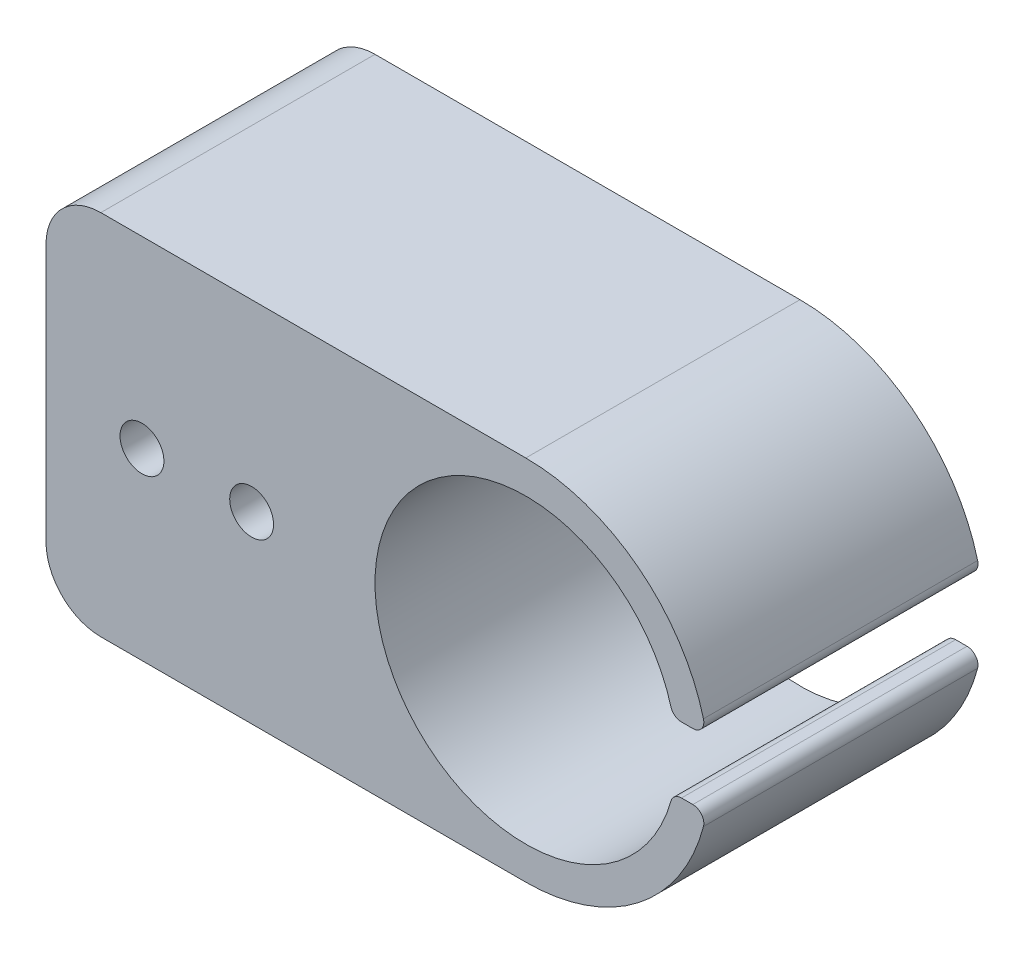
ISO-10303-21;
HEADER;
FILE_DESCRIPTION(('STEP AP214'),'2;1');
FILE_NAME('part.step','',(''),(''),'','','');
FILE_SCHEMA(('AUTOMOTIVE_DESIGN { 1 0 10303 214 1 1 1 1 }'));
ENDSEC;
DATA;
#1=APPLICATION_CONTEXT('core data for automotive mechanical design processes');
#2=APPLICATION_PROTOCOL_DEFINITION('international standard','automotive_design',2000,#1);
#3=PRODUCT_CONTEXT('',#1,'mechanical');
#4=PRODUCT('Part','Part','',(#3));
#5=PRODUCT_RELATED_PRODUCT_CATEGORY('part','',(#4));
#6=PRODUCT_DEFINITION_FORMATION('','',#4);
#7=PRODUCT_DEFINITION_CONTEXT('part definition',#1,'design');
#8=PRODUCT_DEFINITION('design','',#6,#7);
#9=PRODUCT_DEFINITION_SHAPE('','',#8);
#10=(LENGTH_UNIT() NAMED_UNIT(*) SI_UNIT(.MILLI.,.METRE.));
#11=(NAMED_UNIT(*) PLANE_ANGLE_UNIT() SI_UNIT($,.RADIAN.));
#12=(NAMED_UNIT(*) SI_UNIT($,.STERADIAN.) SOLID_ANGLE_UNIT());
#13=UNCERTAINTY_MEASURE_WITH_UNIT(LENGTH_MEASURE(1.E-05),#10,'distance_accuracy_value','');
#14=(GEOMETRIC_REPRESENTATION_CONTEXT(3) GLOBAL_UNCERTAINTY_ASSIGNED_CONTEXT((#13)) GLOBAL_UNIT_ASSIGNED_CONTEXT((#10,
#11,#12)) REPRESENTATION_CONTEXT('',''));
#15=CARTESIAN_POINT('',(0.,0.,0.));
#16=DIRECTION('',(0.,0.,1.));
#17=DIRECTION('',(1.,0.,0.));
#18=AXIS2_PLACEMENT_3D('',#15,#16,#17);
#19=CARTESIAN_POINT('',(-35.,0.,25.));
#20=DIRECTION('',(0.,0.,-1.));
#21=DIRECTION('',(-1.,0.,0.));
#22=AXIS2_PLACEMENT_3D('',#19,#20,#21);
#23=CYLINDRICAL_SURFACE('',#22,2.);
#24=CARTESIAN_POINT('',(-35.,0.,25.));
#25=DIRECTION('',(0.,0.,1.));
#26=DIRECTION('',(1.,0.,0.));
#27=AXIS2_PLACEMENT_3D('',#24,#25,#26);
#28=CIRCLE('',#27,2.);
#29=CARTESIAN_POINT('',(-33.,0.,25.));
#30=VERTEX_POINT('',#29);
#31=EDGE_CURVE('E200',#30,#30,#28,.T.);
#32=ORIENTED_EDGE('',*,*,#31,.T.);
#33=EDGE_LOOP('',(#32));
#34=FACE_BOUND('',#33,.T.);
#35=CARTESIAN_POINT('',(-35.,0.,10.));
#36=DIRECTION('',(0.,0.,-1.));
#37=DIRECTION('',(-1.,0.,0.));
#38=AXIS2_PLACEMENT_3D('',#35,#36,#37);
#39=CIRCLE('',#38,2.);
#40=CARTESIAN_POINT('',(-37.,0.,10.));
#41=VERTEX_POINT('',#40);
#42=EDGE_CURVE('E194',#41,#41,#39,.T.);
#43=ORIENTED_EDGE('',*,*,#42,.T.);
#44=EDGE_LOOP('',(#43));
#45=FACE_BOUND('',#44,.T.);
#46=ADVANCED_FACE('F38',(#34,#45),#23,.F.);
#47=CARTESIAN_POINT('',(-25.,0.,25.));
#48=DIRECTION('',(0.,0.,-1.));
#49=DIRECTION('',(-1.,0.,0.));
#50=AXIS2_PLACEMENT_3D('',#47,#48,#49);
#51=CYLINDRICAL_SURFACE('',#50,2.);
#52=CARTESIAN_POINT('',(-25.,0.,25.));
#53=DIRECTION('',(0.,0.,1.));
#54=DIRECTION('',(1.,0.,0.));
#55=AXIS2_PLACEMENT_3D('',#52,#53,#54);
#56=CIRCLE('',#55,2.);
#57=CARTESIAN_POINT('',(-23.,0.,25.));
#58=VERTEX_POINT('',#57);
#59=EDGE_CURVE('E197',#58,#58,#56,.T.);
#60=ORIENTED_EDGE('',*,*,#59,.T.);
#61=EDGE_LOOP('',(#60));
#62=FACE_BOUND('',#61,.T.);
#63=CARTESIAN_POINT('',(-25.,0.,10.));
#64=DIRECTION('',(0.,0.,-1.));
#65=DIRECTION('',(-1.,0.,0.));
#66=AXIS2_PLACEMENT_3D('',#63,#64,#65);
#67=CIRCLE('',#66,2.);
#68=CARTESIAN_POINT('',(-27.,0.,10.));
#69=VERTEX_POINT('',#68);
#70=EDGE_CURVE('E42',#69,#69,#67,.T.);
#71=ORIENTED_EDGE('',*,*,#70,.T.);
#72=EDGE_LOOP('',(#71));
#73=FACE_BOUND('',#72,.T.);
#74=ADVANCED_FACE('F383',(#62,#73),#51,.F.);
#75=CARTESIAN_POINT('',(0.,0.,25.));
#76=DIRECTION('',(0.,0.,1.));
#77=DIRECTION('',(1.,0.,0.));
#78=AXIS2_PLACEMENT_3D('',#75,#76,#77);
#79=PLANE('',#78);
#80=ORIENTED_EDGE('',*,*,#31,.F.);
#81=EDGE_LOOP('',(#80));
#82=FACE_BOUND('',#81,.T.);
#83=CARTESIAN_POINT('',(0.,0.,25.));
#84=DIRECTION('',(0.,0.,1.));
#85=DIRECTION('',(-1.,0.,0.));
#86=AXIS2_PLACEMENT_3D('',#83,#84,#85);
#87=CIRCLE('',#86,16.75);
#88=CARTESIAN_POINT('',(0.,-16.75,25.));
#89=VERTEX_POINT('',#88);
#90=CARTESIAN_POINT('',(16.2008102912858,-4.25396825396825,25.));
#91=VERTEX_POINT('',#90);
#92=EDGE_CURVE('E220',#89,#91,#87,.T.);
#93=ORIENTED_EDGE('',*,*,#92,.T.);
#94=CARTESIAN_POINT('',(15.2335977365821,-4.,25.));
#95=DIRECTION('',(0.,0.,1.));
#96=DIRECTION('',(1.,0.,0.));
#97=AXIS2_PLACEMENT_3D('',#94,#95,#96);
#98=CIRCLE('',#97,1.);
#99=CARTESIAN_POINT('',(15.2335977365821,-3.,25.));
#100=VERTEX_POINT('',#99);
#101=EDGE_CURVE('E289',#91,#100,#98,.T.);
#102=ORIENTED_EDGE('',*,*,#101,.T.);
#103=DIRECTION('',(-1.,0.,0.));
#104=VECTOR('',#103,1.);
#105=CARTESIAN_POINT('',(16.479153497677,-3.,25.));
#106=LINE('',#105,#104);
#107=CARTESIAN_POINT('',(14.1972708645007,-3.,25.));
#108=VERTEX_POINT('',#107);
#109=EDGE_CURVE('E223',#100,#108,#106,.T.);
#110=ORIENTED_EDGE('',*,*,#109,.T.);
#111=CARTESIAN_POINT('',(14.1972708645007,-4.,25.));
#112=DIRECTION('',(0.,0.,1.));
#113=DIRECTION('',(1.,0.,0.));
#114=AXIS2_PLACEMENT_3D('',#111,#112,#113);
#115=CIRCLE('',#114,1.);
#116=CARTESIAN_POINT('',(13.2347440262295,-3.72881355932203,25.));
#117=VERTEX_POINT('',#116);
#118=EDGE_CURVE('E286',#108,#117,#115,.T.);
#119=ORIENTED_EDGE('',*,*,#118,.T.);
#120=CARTESIAN_POINT('',(0.,0.,25.));
#121=DIRECTION('',(0.,0.,-1.));
#122=DIRECTION('',(1.,0.,0.));
#123=AXIS2_PLACEMENT_3D('',#120,#121,#122);
#124=CIRCLE('',#123,13.75);
#125=CARTESIAN_POINT('',(13.2347440262295,3.72881355932203,25.));
#126=VERTEX_POINT('',#125);
#127=EDGE_CURVE('E204',#117,#126,#124,.T.);
#128=ORIENTED_EDGE('',*,*,#127,.T.);
#129=CARTESIAN_POINT('',(14.1972708645007,4.,25.));
#130=DIRECTION('',(0.,0.,1.));
#131=DIRECTION('',(1.,0.,0.));
#132=AXIS2_PLACEMENT_3D('',#129,#130,#131);
#133=CIRCLE('',#132,1.);
#134=CARTESIAN_POINT('',(14.1972708645007,3.,25.));
#135=VERTEX_POINT('',#134);
#136=EDGE_CURVE('E284',#126,#135,#133,.T.);
#137=ORIENTED_EDGE('',*,*,#136,.T.);
#138=DIRECTION('',(1.,0.,0.));
#139=VECTOR('',#138,1.);
#140=CARTESIAN_POINT('',(13.4187369003196,3.,25.));
#141=LINE('',#140,#139);
#142=CARTESIAN_POINT('',(15.2335977365821,3.,25.));
#143=VERTEX_POINT('',#142);
#144=EDGE_CURVE('E207',#135,#143,#141,.T.);
#145=ORIENTED_EDGE('',*,*,#144,.T.);
#146=CARTESIAN_POINT('',(15.2335977365821,4.,25.));
#147=DIRECTION('',(0.,0.,1.));
#148=DIRECTION('',(1.,0.,0.));
#149=AXIS2_PLACEMENT_3D('',#146,#147,#148);
#150=CIRCLE('',#149,1.);
#151=CARTESIAN_POINT('',(16.2008102912858,4.25396825396825,25.));
#152=VERTEX_POINT('',#151);
#153=EDGE_CURVE('E62',#143,#152,#150,.T.);
#154=ORIENTED_EDGE('',*,*,#153,.T.);
#155=CARTESIAN_POINT('',(0.,0.,25.));
#156=DIRECTION('',(0.,0.,1.));
#157=DIRECTION('',(1.,0.,0.));
#158=AXIS2_PLACEMENT_3D('',#155,#156,#157);
#159=CIRCLE('',#158,16.75);
#160=CARTESIAN_POINT('',(0.,16.75,25.));
#161=VERTEX_POINT('',#160);
#162=EDGE_CURVE('E210',#152,#161,#159,.T.);
#163=ORIENTED_EDGE('',*,*,#162,.T.);
#164=DIRECTION('',(-1.,0.,0.));
#165=VECTOR('',#164,1.);
#166=CARTESIAN_POINT('',(-43.75,16.75,25.));
#167=LINE('',#166,#165);
#168=CARTESIAN_POINT('',(-38.75,16.75,25.));
#169=VERTEX_POINT('',#168);
#170=EDGE_CURVE('E212',#161,#169,#167,.T.);
#171=ORIENTED_EDGE('',*,*,#170,.T.);
#172=CARTESIAN_POINT('',(-38.75,11.75,25.));
#173=DIRECTION('',(0.,0.,1.));
#174=DIRECTION('',(1.,0.,0.));
#175=AXIS2_PLACEMENT_3D('',#172,#173,#174);
#176=CIRCLE('',#175,5.);
#177=CARTESIAN_POINT('',(-43.75,11.75,25.));
#178=VERTEX_POINT('',#177);
#179=EDGE_CURVE('E263',#169,#178,#176,.T.);
#180=ORIENTED_EDGE('',*,*,#179,.T.);
#181=DIRECTION('',(0.,-1.,0.));
#182=VECTOR('',#181,1.);
#183=CARTESIAN_POINT('',(-43.75,-16.75,25.));
#184=LINE('',#183,#182);
#185=CARTESIAN_POINT('',(-43.75,-11.75,25.));
#186=VERTEX_POINT('',#185);
#187=EDGE_CURVE('E215',#178,#186,#184,.T.);
#188=ORIENTED_EDGE('',*,*,#187,.T.);
#189=CARTESIAN_POINT('',(-38.75,-11.75,25.));
#190=DIRECTION('',(0.,0.,1.));
#191=DIRECTION('',(1.,0.,0.));
#192=AXIS2_PLACEMENT_3D('',#189,#190,#191);
#193=CIRCLE('',#192,5.);
#194=CARTESIAN_POINT('',(-38.75,-16.75,25.));
#195=VERTEX_POINT('',#194);
#196=EDGE_CURVE('E265',#186,#195,#193,.T.);
#197=ORIENTED_EDGE('',*,*,#196,.T.);
#198=DIRECTION('',(1.,0.,0.));
#199=VECTOR('',#198,1.);
#200=CARTESIAN_POINT('',(0.,-16.75,25.));
#201=LINE('',#200,#199);
#202=EDGE_CURVE('E218',#195,#89,#201,.T.);
#203=ORIENTED_EDGE('',*,*,#202,.T.);
#204=EDGE_LOOP('',(#93,#102,#110,#119,#128,#137,#145,#154,#163,#171,#180,#188,#197,#203));
#205=FACE_BOUND('',#204,.T.);
#206=ORIENTED_EDGE('',*,*,#59,.F.);
#207=EDGE_LOOP('',(#206));
#208=FACE_BOUND('',#207,.T.);
#209=ADVANCED_FACE('F307',(#82,#205,#208),#79,.T.);
#210=CARTESIAN_POINT('',(0.,0.,0.));
#211=DIRECTION('',(0.,0.,1.));
#212=DIRECTION('',(1.,0.,0.));
#213=AXIS2_PLACEMENT_3D('',#210,#211,#212);
#214=PLANE('',#213);
#215=DIRECTION('',(0.,-1.,0.));
#216=VECTOR('',#215,1.);
#217=CARTESIAN_POINT('',(-43.75,-16.75,0.));
#218=LINE('',#217,#216);
#219=CARTESIAN_POINT('',(-43.75,-10.1,0.));
#220=VERTEX_POINT('',#219);
#221=CARTESIAN_POINT('',(-43.75,-11.75,0.));
#222=VERTEX_POINT('',#221);
#223=EDGE_CURVE('E237',#220,#222,#218,.T.);
#224=ORIENTED_EDGE('',*,*,#223,.F.);
#225=DIRECTION('',(-1.,0.,0.));
#226=VECTOR('',#225,1.);
#227=CARTESIAN_POINT('',(-25.,-10.1,0.));
#228=LINE('',#227,#226);
#229=CARTESIAN_POINT('',(-25.,-10.1,0.));
#230=VERTEX_POINT('',#229);
#231=EDGE_CURVE('E181',#230,#220,#228,.T.);
#232=ORIENTED_EDGE('',*,*,#231,.F.);
#233=CARTESIAN_POINT('',(-25.,0.,0.));
#234=DIRECTION('',(0.,0.,-1.));
#235=DIRECTION('',(-1.,0.,0.));
#236=AXIS2_PLACEMENT_3D('',#233,#234,#235);
#237=CIRCLE('',#236,10.1);
#238=CARTESIAN_POINT('',(-25.,10.1,0.));
#239=VERTEX_POINT('',#238);
#240=EDGE_CURVE('E339',#239,#230,#237,.T.);
#241=ORIENTED_EDGE('',*,*,#240,.F.);
#242=DIRECTION('',(1.,0.,0.));
#243=VECTOR('',#242,1.);
#244=CARTESIAN_POINT('',(-43.75,10.1,0.));
#245=LINE('',#244,#243);
#246=CARTESIAN_POINT('',(-43.75,10.1,0.));
#247=VERTEX_POINT('',#246);
#248=EDGE_CURVE('E336',#247,#239,#245,.T.);
#249=ORIENTED_EDGE('',*,*,#248,.F.);
#250=CARTESIAN_POINT('',(-43.75,11.75,0.));
#251=VERTEX_POINT('',#250);
#252=EDGE_CURVE('E187',#251,#247,#218,.T.);
#253=ORIENTED_EDGE('',*,*,#252,.F.);
#254=CARTESIAN_POINT('',(-38.75,11.75,0.));
#255=DIRECTION('',(0.,0.,1.));
#256=DIRECTION('',(1.,0.,0.));
#257=AXIS2_PLACEMENT_3D('',#254,#255,#256);
#258=CIRCLE('',#257,5.);
#259=CARTESIAN_POINT('',(-38.75,16.75,0.));
#260=VERTEX_POINT('',#259);
#261=EDGE_CURVE('E254',#251,#260,#258,.F.);
#262=ORIENTED_EDGE('',*,*,#261,.T.);
#263=DIRECTION('',(-1.,0.,0.));
#264=VECTOR('',#263,1.);
#265=CARTESIAN_POINT('',(-43.75,16.75,0.));
#266=LINE('',#265,#264);
#267=CARTESIAN_POINT('',(0.,16.75,0.));
#268=VERTEX_POINT('',#267);
#269=EDGE_CURVE('E234',#268,#260,#266,.T.);
#270=ORIENTED_EDGE('',*,*,#269,.F.);
#271=CARTESIAN_POINT('',(0.,0.,0.));
#272=DIRECTION('',(0.,0.,1.));
#273=DIRECTION('',(1.,0.,0.));
#274=AXIS2_PLACEMENT_3D('',#271,#272,#273);
#275=CIRCLE('',#274,16.75);
#276=CARTESIAN_POINT('',(16.2008102912858,4.25396825396825,0.));
#277=VERTEX_POINT('',#276);
#278=EDGE_CURVE('E232',#277,#268,#275,.T.);
#279=ORIENTED_EDGE('',*,*,#278,.F.);
#280=CARTESIAN_POINT('',(15.2335977365821,4.,0.));
#281=DIRECTION('',(0.,0.,1.));
#282=DIRECTION('',(1.,0.,0.));
#283=AXIS2_PLACEMENT_3D('',#280,#281,#282);
#284=CIRCLE('',#283,1.);
#285=CARTESIAN_POINT('',(15.2335977365821,3.,0.));
#286=VERTEX_POINT('',#285);
#287=EDGE_CURVE('E278',#277,#286,#284,.F.);
#288=ORIENTED_EDGE('',*,*,#287,.T.);
#289=DIRECTION('',(1.,0.,0.));
#290=VECTOR('',#289,1.);
#291=CARTESIAN_POINT('',(13.4187369003196,3.,0.));
#292=LINE('',#291,#290);
#293=CARTESIAN_POINT('',(14.1972708645007,3.,0.));
#294=VERTEX_POINT('',#293);
#295=EDGE_CURVE('E229',#294,#286,#292,.T.);
#296=ORIENTED_EDGE('',*,*,#295,.F.);
#297=CARTESIAN_POINT('',(14.1972708645007,4.,0.));
#298=DIRECTION('',(0.,0.,1.));
#299=DIRECTION('',(1.,0.,0.));
#300=AXIS2_PLACEMENT_3D('',#297,#298,#299);
#301=CIRCLE('',#300,1.);
#302=CARTESIAN_POINT('',(13.2347440262295,3.72881355932203,0.));
#303=VERTEX_POINT('',#302);
#304=EDGE_CURVE('E274',#294,#303,#301,.F.);
#305=ORIENTED_EDGE('',*,*,#304,.T.);
#306=CARTESIAN_POINT('',(0.,0.,0.));
#307=DIRECTION('',(0.,0.,-1.));
#308=DIRECTION('',(1.,0.,0.));
#309=AXIS2_PLACEMENT_3D('',#306,#307,#308);
#310=CIRCLE('',#309,13.75);
#311=CARTESIAN_POINT('',(13.2347440262295,-3.72881355932203,0.));
#312=VERTEX_POINT('',#311);
#313=EDGE_CURVE('E203',#312,#303,#310,.T.);
#314=ORIENTED_EDGE('',*,*,#313,.F.);
#315=CARTESIAN_POINT('',(14.1972708645007,-4.,0.));
#316=DIRECTION('',(0.,0.,1.));
#317=DIRECTION('',(1.,0.,0.));
#318=AXIS2_PLACEMENT_3D('',#315,#316,#317);
#319=CIRCLE('',#318,1.);
#320=CARTESIAN_POINT('',(14.1972708645007,-3.,0.));
#321=VERTEX_POINT('',#320);
#322=EDGE_CURVE('E276',#312,#321,#319,.F.);
#323=ORIENTED_EDGE('',*,*,#322,.T.);
#324=DIRECTION('',(-1.,0.,0.));
#325=VECTOR('',#324,1.);
#326=CARTESIAN_POINT('',(16.479153497677,-3.,0.));
#327=LINE('',#326,#325);
#328=CARTESIAN_POINT('',(15.2335977365821,-3.,0.));
#329=VERTEX_POINT('',#328);
#330=EDGE_CURVE('E208',#329,#321,#327,.T.);
#331=ORIENTED_EDGE('',*,*,#330,.F.);
#332=CARTESIAN_POINT('',(15.2335977365821,-4.,0.));
#333=DIRECTION('',(0.,0.,1.));
#334=DIRECTION('',(1.,0.,0.));
#335=AXIS2_PLACEMENT_3D('',#332,#333,#334);
#336=CIRCLE('',#335,1.);
#337=CARTESIAN_POINT('',(16.2008102912858,-4.25396825396825,0.));
#338=VERTEX_POINT('',#337);
#339=EDGE_CURVE('E280',#329,#338,#336,.F.);
#340=ORIENTED_EDGE('',*,*,#339,.T.);
#341=CARTESIAN_POINT('',(0.,0.,0.));
#342=DIRECTION('',(0.,0.,1.));
#343=DIRECTION('',(-1.,0.,0.));
#344=AXIS2_PLACEMENT_3D('',#341,#342,#343);
#345=CIRCLE('',#344,16.75);
#346=CARTESIAN_POINT('',(0.,-16.75,0.));
#347=VERTEX_POINT('',#346);
#348=EDGE_CURVE('E241',#347,#338,#345,.T.);
#349=ORIENTED_EDGE('',*,*,#348,.F.);
#350=DIRECTION('',(1.,0.,0.));
#351=VECTOR('',#350,1.);
#352=CARTESIAN_POINT('',(0.,-16.75,0.));
#353=LINE('',#352,#351);
#354=CARTESIAN_POINT('',(-38.75,-16.75,0.));
#355=VERTEX_POINT('',#354);
#356=EDGE_CURVE('E239',#355,#347,#353,.T.);
#357=ORIENTED_EDGE('',*,*,#356,.F.);
#358=CARTESIAN_POINT('',(-38.75,-11.75,0.));
#359=DIRECTION('',(0.,0.,1.));
#360=DIRECTION('',(1.,0.,0.));
#361=AXIS2_PLACEMENT_3D('',#358,#359,#360);
#362=CIRCLE('',#361,5.);
#363=EDGE_CURVE('E256',#355,#222,#362,.F.);
#364=ORIENTED_EDGE('',*,*,#363,.T.);
#365=EDGE_LOOP('',(#224,#232,#241,#249,#253,#262,#270,#279,#288,#296,#305,#314,#323,#331,#340,
#349,#357,#364));
#366=FACE_BOUND('',#365,.T.);
#367=ADVANCED_FACE('F318',(#366),#214,.F.);
#368=CARTESIAN_POINT('',(0.,0.,25.));
#369=DIRECTION('',(0.,0.,-1.));
#370=DIRECTION('',(-1.,0.,0.));
#371=AXIS2_PLACEMENT_3D('',#368,#369,#370);
#372=CYLINDRICAL_SURFACE('',#371,13.75);
#373=ORIENTED_EDGE('',*,*,#127,.F.);
#374=DIRECTION('',(0.,0.,-1.));
#375=VECTOR('',#374,1.);
#376=CARTESIAN_POINT('',(13.2347440262294,-3.72881355932203,25.));
#377=LINE('',#376,#375);
#378=EDGE_CURVE('E12',#117,#312,#377,.T.);
#379=ORIENTED_EDGE('',*,*,#378,.T.);
#380=ORIENTED_EDGE('',*,*,#313,.T.);
#381=DIRECTION('',(0.,0.,-1.));
#382=VECTOR('',#381,1.);
#383=CARTESIAN_POINT('',(13.2347440262294,3.72881355932203,25.));
#384=LINE('',#383,#382);
#385=EDGE_CURVE('E47',#303,#126,#384,.F.);
#386=ORIENTED_EDGE('',*,*,#385,.T.);
#387=EDGE_LOOP('',(#373,#379,#380,#386));
#388=FACE_BOUND('',#387,.T.);
#389=ADVANCED_FACE('F302',(#388),#372,.F.);
#390=CARTESIAN_POINT('',(13.4187369003196,3.,25.));
#391=DIRECTION('',(0.,1.,0.));
#392=DIRECTION('',(0.,0.,1.));
#393=AXIS2_PLACEMENT_3D('',#390,#391,#392);
#394=PLANE('',#393);
#395=ORIENTED_EDGE('',*,*,#295,.T.);
#396=DIRECTION('',(0.,0.,-1.));
#397=VECTOR('',#396,1.);
#398=CARTESIAN_POINT('',(15.2335977365821,3.,25.));
#399=LINE('',#398,#397);
#400=EDGE_CURVE('E297',#286,#143,#399,.F.);
#401=ORIENTED_EDGE('',*,*,#400,.T.);
#402=ORIENTED_EDGE('',*,*,#144,.F.);
#403=DIRECTION('',(0.,0.,-1.));
#404=VECTOR('',#403,1.);
#405=CARTESIAN_POINT('',(14.1972708645007,3.,25.));
#406=LINE('',#405,#404);
#407=EDGE_CURVE('E294',#135,#294,#406,.T.);
#408=ORIENTED_EDGE('',*,*,#407,.T.);
#409=EDGE_LOOP('',(#395,#401,#402,#408));
#410=FACE_BOUND('',#409,.T.);
#411=ADVANCED_FACE('F314',(#410),#394,.F.);
#412=CARTESIAN_POINT('',(0.,0.,25.));
#413=DIRECTION('',(0.,0.,-1.));
#414=DIRECTION('',(-1.,0.,0.));
#415=AXIS2_PLACEMENT_3D('',#412,#413,#414);
#416=CYLINDRICAL_SURFACE('',#415,16.75);
#417=ORIENTED_EDGE('',*,*,#162,.F.);
#418=DIRECTION('',(0.,0.,-1.));
#419=VECTOR('',#418,1.);
#420=CARTESIAN_POINT('',(16.2008102912858,4.25396825396825,25.));
#421=LINE('',#420,#419);
#422=EDGE_CURVE('E291',#152,#277,#421,.T.);
#423=ORIENTED_EDGE('',*,*,#422,.T.);
#424=ORIENTED_EDGE('',*,*,#278,.T.);
#425=DIRECTION('',(0.,0.,-1.));
#426=VECTOR('',#425,1.);
#427=CARTESIAN_POINT('',(0.,16.75,25.));
#428=LINE('',#427,#426);
#429=EDGE_CURVE('E248',#161,#268,#428,.T.);
#430=ORIENTED_EDGE('',*,*,#429,.F.);
#431=EDGE_LOOP('',(#417,#423,#424,#430));
#432=FACE_BOUND('',#431,.T.);
#433=ADVANCED_FACE('F325',(#432),#416,.T.);
#434=CARTESIAN_POINT('',(-43.75,16.75,25.));
#435=DIRECTION('',(0.,-1.,0.));
#436=DIRECTION('',(0.,0.,-1.));
#437=AXIS2_PLACEMENT_3D('',#434,#435,#436);
#438=PLANE('',#437);
#439=ORIENTED_EDGE('',*,*,#269,.T.);
#440=DIRECTION('',(0.,0.,-1.));
#441=VECTOR('',#440,1.);
#442=CARTESIAN_POINT('',(-38.75,16.75,25.));
#443=LINE('',#442,#441);
#444=EDGE_CURVE('E267',#260,#169,#443,.F.);
#445=ORIENTED_EDGE('',*,*,#444,.T.);
#446=ORIENTED_EDGE('',*,*,#170,.F.);
#447=ORIENTED_EDGE('',*,*,#429,.T.);
#448=EDGE_LOOP('',(#439,#445,#446,#447));
#449=FACE_BOUND('',#448,.T.);
#450=ADVANCED_FACE('F407',(#449),#438,.F.);
#451=CARTESIAN_POINT('',(-43.75,-16.75,25.));
#452=DIRECTION('',(1.,0.,0.));
#453=DIRECTION('',(0.,0.,-1.));
#454=AXIS2_PLACEMENT_3D('',#451,#452,#453);
#455=PLANE('',#454);
#456=DIRECTION('',(0.,1.,0.));
#457=VECTOR('',#456,1.);
#458=CARTESIAN_POINT('',(-43.75,-10.1,10.));
#459=LINE('',#458,#457);
#460=CARTESIAN_POINT('',(-43.75,-10.1,10.));
#461=VERTEX_POINT('',#460);
#462=CARTESIAN_POINT('',(-43.75,10.1,10.));
#463=VERTEX_POINT('',#462);
#464=EDGE_CURVE('E175',#461,#463,#459,.T.);
#465=ORIENTED_EDGE('',*,*,#464,.F.);
#466=DIRECTION('',(0.,0.,-1.));
#467=VECTOR('',#466,1.);
#468=CARTESIAN_POINT('',(-43.75,-10.1,10.));
#469=LINE('',#468,#467);
#470=EDGE_CURVE('E345',#461,#220,#469,.T.);
#471=ORIENTED_EDGE('',*,*,#470,.T.);
#472=ORIENTED_EDGE('',*,*,#223,.T.);
#473=DIRECTION('',(0.,0.,-1.));
#474=VECTOR('',#473,1.);
#475=CARTESIAN_POINT('',(-43.75,-11.75,25.));
#476=LINE('',#475,#474);
#477=EDGE_CURVE('E261',#222,#186,#476,.F.);
#478=ORIENTED_EDGE('',*,*,#477,.T.);
#479=ORIENTED_EDGE('',*,*,#187,.F.);
#480=DIRECTION('',(0.,0.,-1.));
#481=VECTOR('',#480,1.);
#482=CARTESIAN_POINT('',(-43.75,11.75,25.));
#483=LINE('',#482,#481);
#484=EDGE_CURVE('E259',#178,#251,#483,.T.);
#485=ORIENTED_EDGE('',*,*,#484,.T.);
#486=ORIENTED_EDGE('',*,*,#252,.T.);
#487=DIRECTION('',(0.,0.,-1.));
#488=VECTOR('',#487,1.);
#489=CARTESIAN_POINT('',(-43.75,10.1,10.));
#490=LINE('',#489,#488);
#491=EDGE_CURVE('E170',#463,#247,#490,.T.);
#492=ORIENTED_EDGE('',*,*,#491,.F.);
#493=EDGE_LOOP('',(#465,#471,#472,#478,#479,#485,#486,#492));
#494=FACE_BOUND('',#493,.T.);
#495=ADVANCED_FACE('F184',(#494),#455,.F.);
#496=CARTESIAN_POINT('',(0.,-16.75,25.));
#497=DIRECTION('',(0.,1.,0.));
#498=DIRECTION('',(0.,0.,1.));
#499=AXIS2_PLACEMENT_3D('',#496,#497,#498);
#500=PLANE('',#499);
#501=ORIENTED_EDGE('',*,*,#202,.F.);
#502=DIRECTION('',(0.,0.,-1.));
#503=VECTOR('',#502,1.);
#504=CARTESIAN_POINT('',(-38.75,-16.75,25.));
#505=LINE('',#504,#503);
#506=EDGE_CURVE('E251',#195,#355,#505,.T.);
#507=ORIENTED_EDGE('',*,*,#506,.T.);
#508=ORIENTED_EDGE('',*,*,#356,.T.);
#509=DIRECTION('',(0.,0.,-1.));
#510=VECTOR('',#509,1.);
#511=CARTESIAN_POINT('',(0.,-16.75,25.));
#512=LINE('',#511,#510);
#513=EDGE_CURVE('E226',#89,#347,#512,.T.);
#514=ORIENTED_EDGE('',*,*,#513,.F.);
#515=EDGE_LOOP('',(#501,#507,#508,#514));
#516=FACE_BOUND('',#515,.T.);
#517=ADVANCED_FACE('F358',(#516),#500,.F.);
#518=CARTESIAN_POINT('',(0.,0.,25.));
#519=DIRECTION('',(0.,0.,-1.));
#520=DIRECTION('',(-1.,0.,0.));
#521=AXIS2_PLACEMENT_3D('',#518,#519,#520);
#522=CYLINDRICAL_SURFACE('',#521,16.75);
#523=ORIENTED_EDGE('',*,*,#348,.T.);
#524=DIRECTION('',(0.,0.,-1.));
#525=VECTOR('',#524,1.);
#526=CARTESIAN_POINT('',(16.2008102912858,-4.25396825396825,25.));
#527=LINE('',#526,#525);
#528=EDGE_CURVE('E282',#338,#91,#527,.F.);
#529=ORIENTED_EDGE('',*,*,#528,.T.);
#530=ORIENTED_EDGE('',*,*,#92,.F.);
#531=ORIENTED_EDGE('',*,*,#513,.T.);
#532=EDGE_LOOP('',(#523,#529,#530,#531));
#533=FACE_BOUND('',#532,.T.);
#534=ADVANCED_FACE('F364',(#533),#522,.T.);
#535=CARTESIAN_POINT('',(16.479153497677,-3.,25.));
#536=DIRECTION('',(0.,-1.,0.));
#537=DIRECTION('',(0.,0.,-1.));
#538=AXIS2_PLACEMENT_3D('',#535,#536,#537);
#539=PLANE('',#538);
#540=ORIENTED_EDGE('',*,*,#109,.F.);
#541=DIRECTION('',(0.,0.,-1.));
#542=VECTOR('',#541,1.);
#543=CARTESIAN_POINT('',(15.2335977365821,-3.,25.));
#544=LINE('',#543,#542);
#545=EDGE_CURVE('E271',#100,#329,#544,.T.);
#546=ORIENTED_EDGE('',*,*,#545,.T.);
#547=ORIENTED_EDGE('',*,*,#330,.T.);
#548=DIRECTION('',(0.,0.,-1.));
#549=VECTOR('',#548,1.);
#550=CARTESIAN_POINT('',(14.1972708645007,-3.,25.));
#551=LINE('',#550,#549);
#552=EDGE_CURVE('E269',#321,#108,#551,.F.);
#553=ORIENTED_EDGE('',*,*,#552,.T.);
#554=EDGE_LOOP('',(#540,#546,#547,#553));
#555=FACE_BOUND('',#554,.T.);
#556=ADVANCED_FACE('F372',(#555),#539,.F.);
#557=CARTESIAN_POINT('',(-38.75,-11.75,25.));
#558=DIRECTION('',(0.,0.,-1.));
#559=DIRECTION('',(-1.,0.,0.));
#560=AXIS2_PLACEMENT_3D('',#557,#558,#559);
#561=CYLINDRICAL_SURFACE('',#560,5.);
#562=ORIENTED_EDGE('',*,*,#196,.F.);
#563=ORIENTED_EDGE('',*,*,#477,.F.);
#564=ORIENTED_EDGE('',*,*,#363,.F.);
#565=ORIENTED_EDGE('',*,*,#506,.F.);
#566=EDGE_LOOP('',(#562,#563,#564,#565));
#567=FACE_BOUND('',#566,.T.);
#568=ADVANCED_FACE('F356',(#567),#561,.T.);
#569=CARTESIAN_POINT('',(-38.75,11.75,25.));
#570=DIRECTION('',(0.,0.,-1.));
#571=DIRECTION('',(-1.,0.,0.));
#572=AXIS2_PLACEMENT_3D('',#569,#570,#571);
#573=CYLINDRICAL_SURFACE('',#572,5.);
#574=ORIENTED_EDGE('',*,*,#179,.F.);
#575=ORIENTED_EDGE('',*,*,#444,.F.);
#576=ORIENTED_EDGE('',*,*,#261,.F.);
#577=ORIENTED_EDGE('',*,*,#484,.F.);
#578=EDGE_LOOP('',(#574,#575,#576,#577));
#579=FACE_BOUND('',#578,.T.);
#580=ADVANCED_FACE('F334',(#579),#573,.T.);
#581=CARTESIAN_POINT('',(15.2335977365821,-4.,25.));
#582=DIRECTION('',(0.,0.,-1.));
#583=DIRECTION('',(-1.,0.,0.));
#584=AXIS2_PLACEMENT_3D('',#581,#582,#583);
#585=CYLINDRICAL_SURFACE('',#584,1.);
#586=ORIENTED_EDGE('',*,*,#101,.F.);
#587=ORIENTED_EDGE('',*,*,#528,.F.);
#588=ORIENTED_EDGE('',*,*,#339,.F.);
#589=ORIENTED_EDGE('',*,*,#545,.F.);
#590=EDGE_LOOP('',(#586,#587,#588,#589));
#591=FACE_BOUND('',#590,.T.);
#592=ADVANCED_FACE('F368',(#591),#585,.T.);
#593=CARTESIAN_POINT('',(15.2335977365821,4.,25.));
#594=DIRECTION('',(0.,0.,-1.));
#595=DIRECTION('',(-1.,0.,0.));
#596=AXIS2_PLACEMENT_3D('',#593,#594,#595);
#597=CYLINDRICAL_SURFACE('',#596,1.);
#598=ORIENTED_EDGE('',*,*,#153,.F.);
#599=ORIENTED_EDGE('',*,*,#400,.F.);
#600=ORIENTED_EDGE('',*,*,#287,.F.);
#601=ORIENTED_EDGE('',*,*,#422,.F.);
#602=EDGE_LOOP('',(#598,#599,#600,#601));
#603=FACE_BOUND('',#602,.T.);
#604=ADVANCED_FACE('F323',(#603),#597,.T.);
#605=CARTESIAN_POINT('',(14.1972708645007,-4.,25.));
#606=DIRECTION('',(0.,0.,-1.));
#607=DIRECTION('',(-1.,0.,0.));
#608=AXIS2_PLACEMENT_3D('',#605,#606,#607);
#609=CYLINDRICAL_SURFACE('',#608,1.);
#610=ORIENTED_EDGE('',*,*,#118,.F.);
#611=ORIENTED_EDGE('',*,*,#552,.F.);
#612=ORIENTED_EDGE('',*,*,#322,.F.);
#613=ORIENTED_EDGE('',*,*,#378,.F.);
#614=EDGE_LOOP('',(#610,#611,#612,#613));
#615=FACE_BOUND('',#614,.T.);
#616=ADVANCED_FACE('F375',(#615),#609,.T.);
#617=CARTESIAN_POINT('',(14.1972708645007,4.,25.));
#618=DIRECTION('',(0.,0.,-1.));
#619=DIRECTION('',(-1.,0.,0.));
#620=AXIS2_PLACEMENT_3D('',#617,#618,#619);
#621=CYLINDRICAL_SURFACE('',#620,1.);
#622=ORIENTED_EDGE('',*,*,#136,.F.);
#623=ORIENTED_EDGE('',*,*,#385,.F.);
#624=ORIENTED_EDGE('',*,*,#304,.F.);
#625=ORIENTED_EDGE('',*,*,#407,.F.);
#626=EDGE_LOOP('',(#622,#623,#624,#625));
#627=FACE_BOUND('',#626,.T.);
#628=ADVANCED_FACE('F40',(#627),#621,.T.);
#629=CARTESIAN_POINT('',(-25.,-10.1,10.));
#630=DIRECTION('',(0.,-1.,0.));
#631=DIRECTION('',(0.,0.,-1.));
#632=AXIS2_PLACEMENT_3D('',#629,#630,#631);
#633=PLANE('',#632);
#634=ORIENTED_EDGE('',*,*,#231,.T.);
#635=ORIENTED_EDGE('',*,*,#470,.F.);
#636=DIRECTION('',(-1.,0.,0.));
#637=VECTOR('',#636,1.);
#638=CARTESIAN_POINT('',(-25.,-10.1,10.));
#639=LINE('',#638,#637);
#640=CARTESIAN_POINT('',(-25.,-10.1,10.));
#641=VERTEX_POINT('',#640);
#642=EDGE_CURVE('E54',#641,#461,#639,.T.);
#643=ORIENTED_EDGE('',*,*,#642,.F.);
#644=DIRECTION('',(0.,0.,-1.));
#645=VECTOR('',#644,1.);
#646=CARTESIAN_POINT('',(-25.,-10.1,10.));
#647=LINE('',#646,#645);
#648=EDGE_CURVE('E189',#641,#230,#647,.T.);
#649=ORIENTED_EDGE('',*,*,#648,.T.);
#650=EDGE_LOOP('',(#634,#635,#643,#649));
#651=FACE_BOUND('',#650,.T.);
#652=ADVANCED_FACE('F347',(#651),#633,.F.);
#653=CARTESIAN_POINT('',(-25.,0.,10.));
#654=DIRECTION('',(0.,0.,-1.));
#655=DIRECTION('',(-1.,0.,0.));
#656=AXIS2_PLACEMENT_3D('',#653,#654,#655);
#657=CYLINDRICAL_SURFACE('',#656,10.1);
#658=ORIENTED_EDGE('',*,*,#240,.T.);
#659=ORIENTED_EDGE('',*,*,#648,.F.);
#660=CARTESIAN_POINT('',(-25.,0.,10.));
#661=DIRECTION('',(0.,0.,-1.));
#662=DIRECTION('',(-1.,0.,0.));
#663=AXIS2_PLACEMENT_3D('',#660,#661,#662);
#664=CIRCLE('',#663,10.1);
#665=CARTESIAN_POINT('',(-25.,10.1,10.));
#666=VERTEX_POINT('',#665);
#667=EDGE_CURVE('E174',#666,#641,#664,.T.);
#668=ORIENTED_EDGE('',*,*,#667,.F.);
#669=DIRECTION('',(0.,0.,-1.));
#670=VECTOR('',#669,1.);
#671=CARTESIAN_POINT('',(-25.,10.1,10.));
#672=LINE('',#671,#670);
#673=EDGE_CURVE('E172',#666,#239,#672,.T.);
#674=ORIENTED_EDGE('',*,*,#673,.T.);
#675=EDGE_LOOP('',(#658,#659,#668,#674));
#676=FACE_BOUND('',#675,.T.);
#677=ADVANCED_FACE('F349',(#676),#657,.F.);
#678=CARTESIAN_POINT('',(-43.75,10.1,10.));
#679=DIRECTION('',(0.,1.,0.));
#680=DIRECTION('',(-1.,0.,0.));
#681=AXIS2_PLACEMENT_3D('',#678,#679,#680);
#682=PLANE('',#681);
#683=ORIENTED_EDGE('',*,*,#248,.T.);
#684=ORIENTED_EDGE('',*,*,#673,.F.);
#685=DIRECTION('',(1.,0.,0.));
#686=VECTOR('',#685,1.);
#687=CARTESIAN_POINT('',(-43.75,10.1,10.));
#688=LINE('',#687,#686);
#689=EDGE_CURVE('E166',#463,#666,#688,.T.);
#690=ORIENTED_EDGE('',*,*,#689,.F.);
#691=ORIENTED_EDGE('',*,*,#491,.T.);
#692=EDGE_LOOP('',(#683,#684,#690,#691));
#693=FACE_BOUND('',#692,.T.);
#694=ADVANCED_FACE('F168',(#693),#682,.F.);
#695=CARTESIAN_POINT('',(-25.,0.,10.));
#696=DIRECTION('',(0.,0.,-1.));
#697=DIRECTION('',(-1.,0.,0.));
#698=AXIS2_PLACEMENT_3D('',#695,#696,#697);
#699=PLANE('',#698);
#700=ORIENTED_EDGE('',*,*,#42,.F.);
#701=EDGE_LOOP('',(#700));
#702=FACE_BOUND('',#701,.T.);
#703=ORIENTED_EDGE('',*,*,#70,.F.);
#704=EDGE_LOOP('',(#703));
#705=FACE_BOUND('',#704,.T.);
#706=ORIENTED_EDGE('',*,*,#464,.T.);
#707=ORIENTED_EDGE('',*,*,#689,.T.);
#708=ORIENTED_EDGE('',*,*,#667,.T.);
#709=ORIENTED_EDGE('',*,*,#642,.T.);
#710=EDGE_LOOP('',(#706,#707,#708,#709));
#711=FACE_BOUND('',#710,.T.);
#712=ADVANCED_FACE('F178',(#702,#705,#711),#699,.T.);
#713=CLOSED_SHELL('',(#46,#74,#209,#367,#389,#411,#433,#450,#495,#517,#534,#556,#568,#580,#592,
#604,#616,#628,#652,#677,#694,#712));
#714=MANIFOLD_SOLID_BREP('B2',#713);
#715=ADVANCED_BREP_SHAPE_REPRESENTATION('',(#18,#714),#14);
#716=SHAPE_DEFINITION_REPRESENTATION(#9,#715);
ENDSEC;
END-ISO-10303-21;
